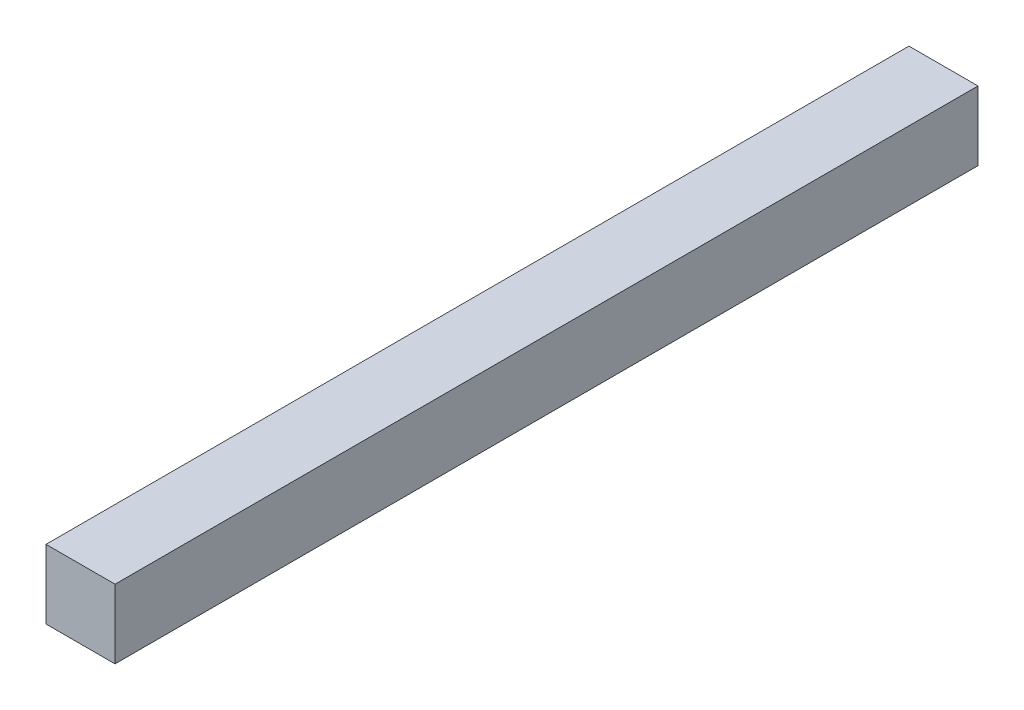
ISO-10303-21;
HEADER;
FILE_DESCRIPTION(('STEP AP214'),'2;1');
FILE_NAME('part.step','',(''),(''),'','','');
FILE_SCHEMA(('AUTOMOTIVE_DESIGN { 1 0 10303 214 1 1 1 1 }'));
ENDSEC;
DATA;
#1=APPLICATION_CONTEXT('core data for automotive mechanical design processes');
#2=APPLICATION_PROTOCOL_DEFINITION('international standard','automotive_design',2000,#1);
#3=PRODUCT_CONTEXT('',#1,'mechanical');
#4=PRODUCT('Part','Part','',(#3));
#5=PRODUCT_RELATED_PRODUCT_CATEGORY('part','',(#4));
#6=PRODUCT_DEFINITION_FORMATION('','',#4);
#7=PRODUCT_DEFINITION_CONTEXT('part definition',#1,'design');
#8=PRODUCT_DEFINITION('design','',#6,#7);
#9=PRODUCT_DEFINITION_SHAPE('','',#8);
#10=(LENGTH_UNIT() NAMED_UNIT(*) SI_UNIT(.MILLI.,.METRE.));
#11=(NAMED_UNIT(*) PLANE_ANGLE_UNIT() SI_UNIT($,.RADIAN.));
#12=(NAMED_UNIT(*) SI_UNIT($,.STERADIAN.) SOLID_ANGLE_UNIT());
#13=UNCERTAINTY_MEASURE_WITH_UNIT(LENGTH_MEASURE(1.E-05),#10,'distance_accuracy_value','');
#14=(GEOMETRIC_REPRESENTATION_CONTEXT(3) GLOBAL_UNCERTAINTY_ASSIGNED_CONTEXT((#13)) GLOBAL_UNIT_ASSIGNED_CONTEXT((#10,
#11,#12)) REPRESENTATION_CONTEXT('',''));
#15=CARTESIAN_POINT('',(0.,0.,0.));
#16=DIRECTION('',(0.,0.,1.));
#17=DIRECTION('',(1.,0.,0.));
#18=AXIS2_PLACEMENT_3D('',#15,#16,#17);
#19=CARTESIAN_POINT('',(10.,-10.,250.));
#20=DIRECTION('',(-1.,0.,0.));
#21=DIRECTION('',(0.,0.,1.));
#22=AXIS2_PLACEMENT_3D('',#19,#20,#21);
#23=PLANE('',#22);
#24=DIRECTION('',(0.,1.,0.));
#25=VECTOR('',#24,1.);
#26=CARTESIAN_POINT('',(10.,-10.,0.));
#27=LINE('',#26,#25);
#28=CARTESIAN_POINT('',(10.,-10.,0.));
#29=VERTEX_POINT('',#28);
#30=CARTESIAN_POINT('',(10.,10.,0.));
#31=VERTEX_POINT('',#30);
#32=EDGE_CURVE('E96',#29,#31,#27,.T.);
#33=ORIENTED_EDGE('',*,*,#32,.T.);
#34=DIRECTION('',(0.,0.,-1.));
#35=VECTOR('',#34,1.);
#36=CARTESIAN_POINT('',(10.,10.,250.));
#37=LINE('',#36,#35);
#38=CARTESIAN_POINT('',(10.,10.,250.));
#39=VERTEX_POINT('',#38);
#40=EDGE_CURVE('E11',#39,#31,#37,.T.);
#41=ORIENTED_EDGE('',*,*,#40,.F.);
#42=DIRECTION('',(0.,1.,0.));
#43=VECTOR('',#42,1.);
#44=CARTESIAN_POINT('',(10.,-10.,250.));
#45=LINE('',#44,#43);
#46=CARTESIAN_POINT('',(10.,-10.,250.));
#47=VERTEX_POINT('',#46);
#48=EDGE_CURVE('E84',#47,#39,#45,.T.);
#49=ORIENTED_EDGE('',*,*,#48,.F.);
#50=DIRECTION('',(0.,0.,-1.));
#51=VECTOR('',#50,1.);
#52=CARTESIAN_POINT('',(10.,-10.,250.));
#53=LINE('',#52,#51);
#54=EDGE_CURVE('E92',#47,#29,#53,.T.);
#55=ORIENTED_EDGE('',*,*,#54,.T.);
#56=EDGE_LOOP('',(#33,#41,#49,#55));
#57=FACE_BOUND('',#56,.T.);
#58=ADVANCED_FACE('F33',(#57),#23,.F.);
#59=CARTESIAN_POINT('',(-10.,10.,250.));
#60=DIRECTION('',(0.,-1.,0.));
#61=DIRECTION('',(0.,0.,-1.));
#62=AXIS2_PLACEMENT_3D('',#59,#60,#61);
#63=PLANE('',#62);
#64=DIRECTION('',(-1.,0.,0.));
#65=VECTOR('',#64,1.);
#66=CARTESIAN_POINT('',(-10.,10.,0.));
#67=LINE('',#66,#65);
#68=CARTESIAN_POINT('',(-10.,10.,0.));
#69=VERTEX_POINT('',#68);
#70=EDGE_CURVE('E88',#31,#69,#67,.T.);
#71=ORIENTED_EDGE('',*,*,#70,.T.);
#72=DIRECTION('',(0.,0.,-1.));
#73=VECTOR('',#72,1.);
#74=CARTESIAN_POINT('',(-10.,10.,250.));
#75=LINE('',#74,#73);
#76=CARTESIAN_POINT('',(-10.,10.,250.));
#77=VERTEX_POINT('',#76);
#78=EDGE_CURVE('E41',#77,#69,#75,.T.);
#79=ORIENTED_EDGE('',*,*,#78,.F.);
#80=DIRECTION('',(-1.,0.,0.));
#81=VECTOR('',#80,1.);
#82=CARTESIAN_POINT('',(-10.,10.,250.));
#83=LINE('',#82,#81);
#84=EDGE_CURVE('E79',#39,#77,#83,.T.);
#85=ORIENTED_EDGE('',*,*,#84,.F.);
#86=ORIENTED_EDGE('',*,*,#40,.T.);
#87=EDGE_LOOP('',(#71,#79,#85,#86));
#88=FACE_BOUND('',#87,.T.);
#89=ADVANCED_FACE('F87',(#88),#63,.F.);
#90=CARTESIAN_POINT('',(-10.,-10.,250.));
#91=DIRECTION('',(1.,0.,0.));
#92=DIRECTION('',(0.,0.,-1.));
#93=AXIS2_PLACEMENT_3D('',#90,#91,#92);
#94=PLANE('',#93);
#95=DIRECTION('',(0.,-1.,0.));
#96=VECTOR('',#95,1.);
#97=CARTESIAN_POINT('',(-10.,-10.,0.));
#98=LINE('',#97,#96);
#99=CARTESIAN_POINT('',(-10.,-10.,0.));
#100=VERTEX_POINT('',#99);
#101=EDGE_CURVE('E66',#69,#100,#98,.T.);
#102=ORIENTED_EDGE('',*,*,#101,.T.);
#103=DIRECTION('',(0.,0.,-1.));
#104=VECTOR('',#103,1.);
#105=CARTESIAN_POINT('',(-10.,-10.,250.));
#106=LINE('',#105,#104);
#107=CARTESIAN_POINT('',(-10.,-10.,250.));
#108=VERTEX_POINT('',#107);
#109=EDGE_CURVE('E89',#108,#100,#106,.T.);
#110=ORIENTED_EDGE('',*,*,#109,.F.);
#111=DIRECTION('',(0.,-1.,0.));
#112=VECTOR('',#111,1.);
#113=CARTESIAN_POINT('',(-10.,-10.,250.));
#114=LINE('',#113,#112);
#115=EDGE_CURVE('E82',#77,#108,#114,.T.);
#116=ORIENTED_EDGE('',*,*,#115,.F.);
#117=ORIENTED_EDGE('',*,*,#78,.T.);
#118=EDGE_LOOP('',(#102,#110,#116,#117));
#119=FACE_BOUND('',#118,.T.);
#120=ADVANCED_FACE('F90',(#119),#94,.F.);
#121=CARTESIAN_POINT('',(-10.,-10.,250.));
#122=DIRECTION('',(0.,1.,0.));
#123=DIRECTION('',(0.,0.,1.));
#124=AXIS2_PLACEMENT_3D('',#121,#122,#123);
#125=PLANE('',#124);
#126=DIRECTION('',(1.,0.,0.));
#127=VECTOR('',#126,1.);
#128=CARTESIAN_POINT('',(-10.,-10.,0.));
#129=LINE('',#128,#127);
#130=EDGE_CURVE('E72',#100,#29,#129,.T.);
#131=ORIENTED_EDGE('',*,*,#130,.T.);
#132=ORIENTED_EDGE('',*,*,#54,.F.);
#133=DIRECTION('',(1.,0.,0.));
#134=VECTOR('',#133,1.);
#135=CARTESIAN_POINT('',(-10.,-10.,250.));
#136=LINE('',#135,#134);
#137=EDGE_CURVE('E49',#108,#47,#136,.T.);
#138=ORIENTED_EDGE('',*,*,#137,.F.);
#139=ORIENTED_EDGE('',*,*,#109,.T.);
#140=EDGE_LOOP('',(#131,#132,#138,#139));
#141=FACE_BOUND('',#140,.T.);
#142=ADVANCED_FACE('F103',(#141),#125,.F.);
#143=CARTESIAN_POINT('',(0.,0.,250.));
#144=DIRECTION('',(0.,0.,-1.));
#145=DIRECTION('',(-1.,0.,0.));
#146=AXIS2_PLACEMENT_3D('',#143,#144,#145);
#147=PLANE('',#146);
#148=ORIENTED_EDGE('',*,*,#48,.T.);
#149=ORIENTED_EDGE('',*,*,#84,.T.);
#150=ORIENTED_EDGE('',*,*,#115,.T.);
#151=ORIENTED_EDGE('',*,*,#137,.T.);
#152=EDGE_LOOP('',(#148,#149,#150,#151));
#153=FACE_BOUND('',#152,.T.);
#154=ADVANCED_FACE('F80',(#153),#147,.F.);
#155=CARTESIAN_POINT('',(0.,0.,0.));
#156=DIRECTION('',(0.,0.,-1.));
#157=DIRECTION('',(-1.,0.,0.));
#158=AXIS2_PLACEMENT_3D('',#155,#156,#157);
#159=PLANE('',#158);
#160=ORIENTED_EDGE('',*,*,#32,.F.);
#161=ORIENTED_EDGE('',*,*,#130,.F.);
#162=ORIENTED_EDGE('',*,*,#101,.F.);
#163=ORIENTED_EDGE('',*,*,#70,.F.);
#164=EDGE_LOOP('',(#160,#161,#162,#163));
#165=FACE_BOUND('',#164,.T.);
#166=ADVANCED_FACE('F106',(#165),#159,.T.);
#167=CLOSED_SHELL('',(#58,#89,#120,#142,#154,#166));
#168=MANIFOLD_SOLID_BREP('B2',#167);
#169=ADVANCED_BREP_SHAPE_REPRESENTATION('',(#18,#168),#14);
#170=SHAPE_DEFINITION_REPRESENTATION(#9,#169);
ENDSEC;
END-ISO-10303-21;
